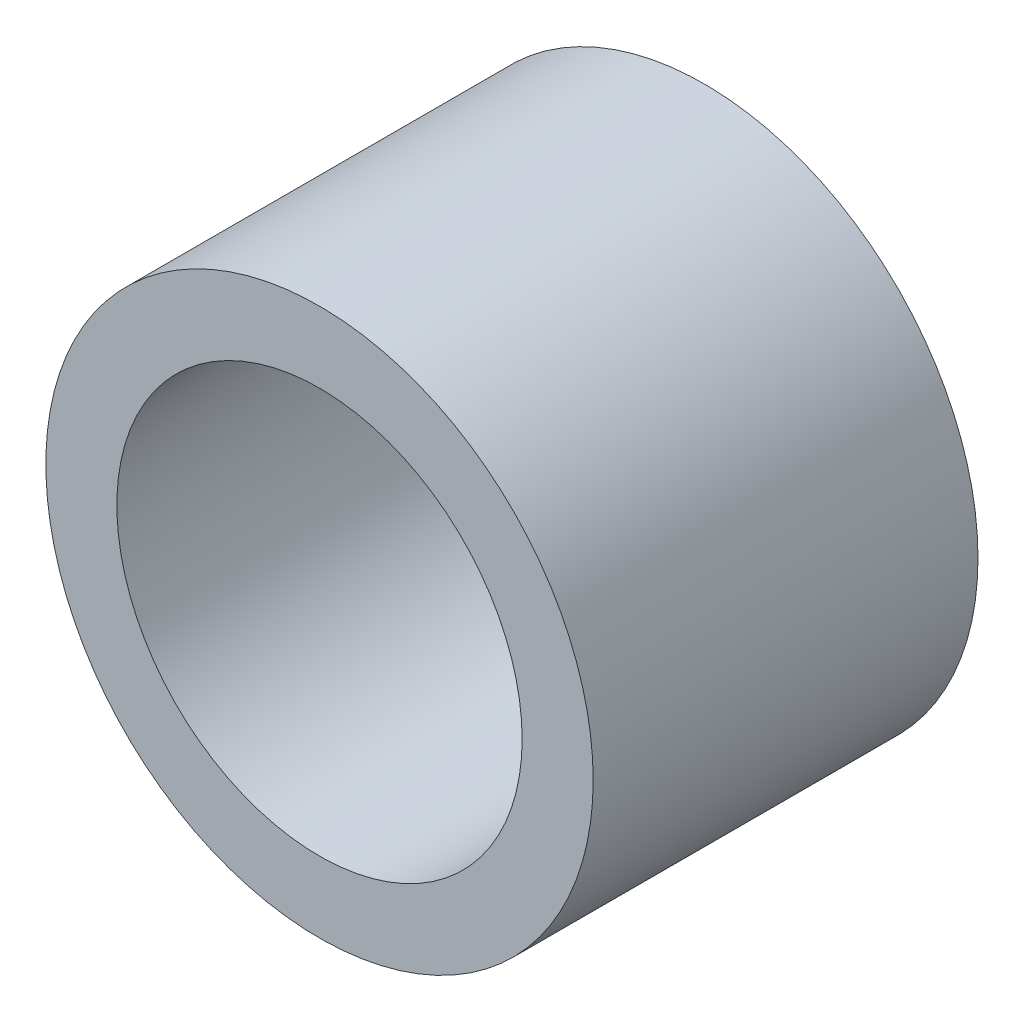
ISO-10303-21;
HEADER;
FILE_DESCRIPTION(('STEP AP214'),'2;1');
FILE_NAME('part.step','',(''),(''),'','','');
FILE_SCHEMA(('AUTOMOTIVE_DESIGN { 1 0 10303 214 1 1 1 1 }'));
ENDSEC;
DATA;
#1=APPLICATION_CONTEXT('core data for automotive mechanical design processes');
#2=APPLICATION_PROTOCOL_DEFINITION('international standard','automotive_design',2000,#1);
#3=PRODUCT_CONTEXT('',#1,'mechanical');
#4=PRODUCT('Part','Part','',(#3));
#5=PRODUCT_RELATED_PRODUCT_CATEGORY('part','',(#4));
#6=PRODUCT_DEFINITION_FORMATION('','',#4);
#7=PRODUCT_DEFINITION_CONTEXT('part definition',#1,'design');
#8=PRODUCT_DEFINITION('design','',#6,#7);
#9=PRODUCT_DEFINITION_SHAPE('','',#8);
#10=(LENGTH_UNIT() NAMED_UNIT(*) SI_UNIT(.MILLI.,.METRE.));
#11=(NAMED_UNIT(*) PLANE_ANGLE_UNIT() SI_UNIT($,.RADIAN.));
#12=(NAMED_UNIT(*) SI_UNIT($,.STERADIAN.) SOLID_ANGLE_UNIT());
#13=UNCERTAINTY_MEASURE_WITH_UNIT(LENGTH_MEASURE(1.E-05),#10,'distance_accuracy_value','');
#14=(GEOMETRIC_REPRESENTATION_CONTEXT(3) GLOBAL_UNCERTAINTY_ASSIGNED_CONTEXT((#13)) GLOBAL_UNIT_ASSIGNED_CONTEXT((#10,
#11,#12)) REPRESENTATION_CONTEXT('',''));
#15=CARTESIAN_POINT('',(0.,0.,0.));
#16=DIRECTION('',(0.,0.,1.));
#17=DIRECTION('',(1.,0.,0.));
#18=AXIS2_PLACEMENT_3D('',#15,#16,#17);
#19=CARTESIAN_POINT('',(0.,0.,7.5));
#20=DIRECTION('',(0.,0.,1.));
#21=DIRECTION('',(1.,0.,0.));
#22=AXIS2_PLACEMENT_3D('',#19,#20,#21);
#23=PLANE('',#22);
#24=CARTESIAN_POINT('',(0.,0.,7.5));
#25=DIRECTION('',(0.,0.,1.));
#26=DIRECTION('',(1.,0.,0.));
#27=AXIS2_PLACEMENT_3D('',#24,#25,#26);
#28=CIRCLE('',#27,10.668);
#29=CARTESIAN_POINT('',(10.668,0.,7.5));
#30=VERTEX_POINT('',#29);
#31=EDGE_CURVE('E11',#30,#30,#28,.T.);
#32=ORIENTED_EDGE('',*,*,#31,.T.);
#33=EDGE_LOOP('',(#32));
#34=FACE_BOUND('',#33,.T.);
#35=CARTESIAN_POINT('',(0.,0.,7.5));
#36=DIRECTION('',(0.,0.,1.));
#37=DIRECTION('',(1.,0.,0.));
#38=AXIS2_PLACEMENT_3D('',#35,#36,#37);
#39=CIRCLE('',#38,7.8994);
#40=CARTESIAN_POINT('',(7.8994,0.,7.5));
#41=VERTEX_POINT('',#40);
#42=EDGE_CURVE('E56',#41,#41,#39,.T.);
#43=ORIENTED_EDGE('',*,*,#42,.F.);
#44=EDGE_LOOP('',(#43));
#45=FACE_BOUND('',#44,.T.);
#46=ADVANCED_FACE('F43',(#34,#45),#23,.T.);
#47=CARTESIAN_POINT('',(0.,0.,-7.5));
#48=DIRECTION('',(0.,0.,1.));
#49=DIRECTION('',(1.,0.,0.));
#50=AXIS2_PLACEMENT_3D('',#47,#48,#49);
#51=PLANE('',#50);
#52=CARTESIAN_POINT('',(0.,0.,-7.5));
#53=DIRECTION('',(0.,0.,1.));
#54=DIRECTION('',(1.,0.,0.));
#55=AXIS2_PLACEMENT_3D('',#52,#53,#54);
#56=CIRCLE('',#55,10.668);
#57=CARTESIAN_POINT('',(10.668,0.,-7.5));
#58=VERTEX_POINT('',#57);
#59=EDGE_CURVE('E47',#58,#58,#56,.T.);
#60=ORIENTED_EDGE('',*,*,#59,.F.);
#61=EDGE_LOOP('',(#60));
#62=FACE_BOUND('',#61,.T.);
#63=CARTESIAN_POINT('',(0.,0.,-7.5));
#64=DIRECTION('',(0.,0.,1.));
#65=DIRECTION('',(1.,0.,0.));
#66=AXIS2_PLACEMENT_3D('',#63,#64,#65);
#67=CIRCLE('',#66,7.8994);
#68=CARTESIAN_POINT('',(7.8994,0.,-7.5));
#69=VERTEX_POINT('',#68);
#70=EDGE_CURVE('E58',#69,#69,#67,.T.);
#71=ORIENTED_EDGE('',*,*,#70,.T.);
#72=EDGE_LOOP('',(#71));
#73=FACE_BOUND('',#72,.T.);
#74=ADVANCED_FACE('F70',(#62,#73),#51,.F.);
#75=CARTESIAN_POINT('',(0.,0.,7.5));
#76=DIRECTION('',(0.,0.,-1.));
#77=DIRECTION('',(-1.,0.,0.));
#78=AXIS2_PLACEMENT_3D('',#75,#76,#77);
#79=CYLINDRICAL_SURFACE('',#78,10.668);
#80=ORIENTED_EDGE('',*,*,#31,.F.);
#81=EDGE_LOOP('',(#80));
#82=FACE_BOUND('',#81,.T.);
#83=ORIENTED_EDGE('',*,*,#59,.T.);
#84=EDGE_LOOP('',(#83));
#85=FACE_BOUND('',#84,.T.);
#86=ADVANCED_FACE('F45',(#82,#85),#79,.T.);
#87=CARTESIAN_POINT('',(0.,0.,7.5));
#88=DIRECTION('',(0.,0.,-1.));
#89=DIRECTION('',(-1.,0.,0.));
#90=AXIS2_PLACEMENT_3D('',#87,#88,#89);
#91=CYLINDRICAL_SURFACE('',#90,7.8994);
#92=ORIENTED_EDGE('',*,*,#42,.T.);
#93=EDGE_LOOP('',(#92));
#94=FACE_BOUND('',#93,.T.);
#95=ORIENTED_EDGE('',*,*,#70,.F.);
#96=EDGE_LOOP('',(#95));
#97=FACE_BOUND('',#96,.T.);
#98=ADVANCED_FACE('F66',(#94,#97),#91,.F.);
#99=CLOSED_SHELL('',(#46,#74,#86,#98));
#100=MANIFOLD_SOLID_BREP('B2',#99);
#101=ADVANCED_BREP_SHAPE_REPRESENTATION('',(#18,#100),#14);
#102=SHAPE_DEFINITION_REPRESENTATION(#9,#101);
ENDSEC;
END-ISO-10303-21;
